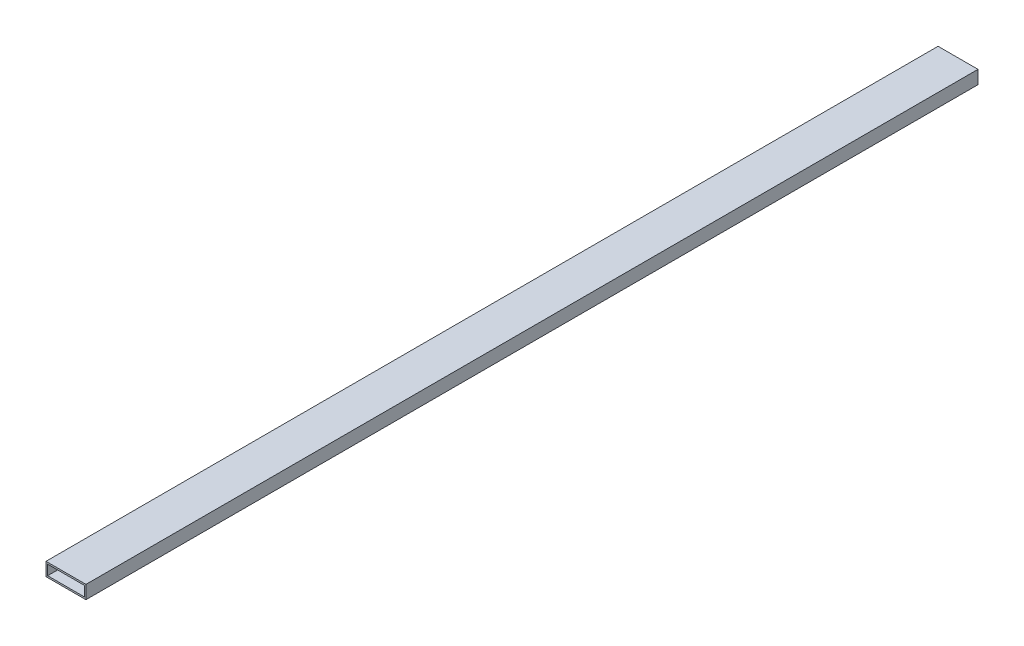
ISO-10303-21;
HEADER;
FILE_DESCRIPTION(('STEP AP214'),'2;1');
FILE_NAME('part.step','',(''),(''),'','','');
FILE_SCHEMA(('AUTOMOTIVE_DESIGN { 1 0 10303 214 1 1 1 1 }'));
ENDSEC;
DATA;
#1=APPLICATION_CONTEXT('core data for automotive mechanical design processes');
#2=APPLICATION_PROTOCOL_DEFINITION('international standard','automotive_design',2000,#1);
#3=PRODUCT_CONTEXT('',#1,'mechanical');
#4=PRODUCT('Part','Part','',(#3));
#5=PRODUCT_RELATED_PRODUCT_CATEGORY('part','',(#4));
#6=PRODUCT_DEFINITION_FORMATION('','',#4);
#7=PRODUCT_DEFINITION_CONTEXT('part definition',#1,'design');
#8=PRODUCT_DEFINITION('design','',#6,#7);
#9=PRODUCT_DEFINITION_SHAPE('','',#8);
#10=(LENGTH_UNIT() NAMED_UNIT(*) SI_UNIT(.MILLI.,.METRE.));
#11=(NAMED_UNIT(*) PLANE_ANGLE_UNIT() SI_UNIT($,.RADIAN.));
#12=(NAMED_UNIT(*) SI_UNIT($,.STERADIAN.) SOLID_ANGLE_UNIT());
#13=UNCERTAINTY_MEASURE_WITH_UNIT(LENGTH_MEASURE(1.E-05),#10,'distance_accuracy_value','');
#14=(GEOMETRIC_REPRESENTATION_CONTEXT(3) GLOBAL_UNCERTAINTY_ASSIGNED_CONTEXT((#13)) GLOBAL_UNIT_ASSIGNED_CONTEXT((#10,
#11,#12)) REPRESENTATION_CONTEXT('',''));
#15=CARTESIAN_POINT('',(0.,0.,0.));
#16=DIRECTION('',(0.,0.,1.));
#17=DIRECTION('',(1.,0.,0.));
#18=AXIS2_PLACEMENT_3D('',#15,#16,#17);
#19=CARTESIAN_POINT('',(38.1,12.7,-850.9));
#20=DIRECTION('',(1.,0.,0.));
#21=DIRECTION('',(0.,1.,0.));
#22=AXIS2_PLACEMENT_3D('',#19,#20,#21);
#23=PLANE('',#22);
#24=DIRECTION('',(0.,1.,0.));
#25=VECTOR('',#24,1.);
#26=CARTESIAN_POINT('',(38.1,12.7,850.9));
#27=LINE('',#26,#25);
#28=CARTESIAN_POINT('',(38.1,-12.7,850.9));
#29=VERTEX_POINT('',#28);
#30=CARTESIAN_POINT('',(38.1,12.7,850.9));
#31=VERTEX_POINT('',#30);
#32=EDGE_CURVE('E130',#29,#31,#27,.T.);
#33=ORIENTED_EDGE('',*,*,#32,.F.);
#34=DIRECTION('',(0.,0.,1.));
#35=VECTOR('',#34,1.);
#36=CARTESIAN_POINT('',(38.1,-12.7,-850.9));
#37=LINE('',#36,#35);
#38=CARTESIAN_POINT('',(38.1,-12.7,-850.9));
#39=VERTEX_POINT('',#38);
#40=EDGE_CURVE('E11',#39,#29,#37,.T.);
#41=ORIENTED_EDGE('',*,*,#40,.F.);
#42=DIRECTION('',(0.,1.,0.));
#43=VECTOR('',#42,1.);
#44=CARTESIAN_POINT('',(38.1,12.7,-850.9));
#45=LINE('',#44,#43);
#46=CARTESIAN_POINT('',(38.1,12.7,-850.9));
#47=VERTEX_POINT('',#46);
#48=EDGE_CURVE('E134',#39,#47,#45,.T.);
#49=ORIENTED_EDGE('',*,*,#48,.T.);
#50=DIRECTION('',(0.,0.,1.));
#51=VECTOR('',#50,1.);
#52=CARTESIAN_POINT('',(38.1,12.7,-850.9));
#53=LINE('',#52,#51);
#54=EDGE_CURVE('E35',#47,#31,#53,.T.);
#55=ORIENTED_EDGE('',*,*,#54,.T.);
#56=EDGE_LOOP('',(#33,#41,#49,#55));
#57=FACE_BOUND('',#56,.T.);
#58=ADVANCED_FACE('F32',(#57),#23,.T.);
#59=CARTESIAN_POINT('',(-38.1,-12.7,-850.9));
#60=DIRECTION('',(0.,-1.,0.));
#61=DIRECTION('',(0.,0.,-1.));
#62=AXIS2_PLACEMENT_3D('',#59,#60,#61);
#63=PLANE('',#62);
#64=DIRECTION('',(1.,0.,0.));
#65=VECTOR('',#64,1.);
#66=CARTESIAN_POINT('',(-38.1,-12.7,850.9));
#67=LINE('',#66,#65);
#68=CARTESIAN_POINT('',(-38.1,-12.7,850.9));
#69=VERTEX_POINT('',#68);
#70=EDGE_CURVE('E138',#69,#29,#67,.T.);
#71=ORIENTED_EDGE('',*,*,#70,.F.);
#72=DIRECTION('',(0.,0.,1.));
#73=VECTOR('',#72,1.);
#74=CARTESIAN_POINT('',(-38.1,-12.7,-850.9));
#75=LINE('',#74,#73);
#76=CARTESIAN_POINT('',(-38.1,-12.7,-850.9));
#77=VERTEX_POINT('',#76);
#78=EDGE_CURVE('E40',#77,#69,#75,.T.);
#79=ORIENTED_EDGE('',*,*,#78,.F.);
#80=DIRECTION('',(1.,0.,0.));
#81=VECTOR('',#80,1.);
#82=CARTESIAN_POINT('',(-38.1,-12.7,-850.9));
#83=LINE('',#82,#81);
#84=EDGE_CURVE('E144',#77,#39,#83,.T.);
#85=ORIENTED_EDGE('',*,*,#84,.T.);
#86=ORIENTED_EDGE('',*,*,#40,.T.);
#87=EDGE_LOOP('',(#71,#79,#85,#86));
#88=FACE_BOUND('',#87,.T.);
#89=ADVANCED_FACE('F170',(#88),#63,.T.);
#90=CARTESIAN_POINT('',(-38.1,12.7,-850.9));
#91=DIRECTION('',(-1.,0.,0.));
#92=DIRECTION('',(0.,0.,1.));
#93=AXIS2_PLACEMENT_3D('',#90,#91,#92);
#94=PLANE('',#93);
#95=DIRECTION('',(0.,-1.,0.));
#96=VECTOR('',#95,1.);
#97=CARTESIAN_POINT('',(-38.1,12.7,850.9));
#98=LINE('',#97,#96);
#99=CARTESIAN_POINT('',(-38.1,12.7,850.9));
#100=VERTEX_POINT('',#99);
#101=EDGE_CURVE('E152',#100,#69,#98,.T.);
#102=ORIENTED_EDGE('',*,*,#101,.F.);
#103=DIRECTION('',(0.,0.,1.));
#104=VECTOR('',#103,1.);
#105=CARTESIAN_POINT('',(-38.1,12.7,-850.9));
#106=LINE('',#105,#104);
#107=CARTESIAN_POINT('',(-38.1,12.7,-850.9));
#108=VERTEX_POINT('',#107);
#109=EDGE_CURVE('E157',#108,#100,#106,.T.);
#110=ORIENTED_EDGE('',*,*,#109,.F.);
#111=DIRECTION('',(0.,-1.,0.));
#112=VECTOR('',#111,1.);
#113=CARTESIAN_POINT('',(-38.1,12.7,-850.9));
#114=LINE('',#113,#112);
#115=EDGE_CURVE('E141',#108,#77,#114,.T.);
#116=ORIENTED_EDGE('',*,*,#115,.T.);
#117=ORIENTED_EDGE('',*,*,#78,.T.);
#118=EDGE_LOOP('',(#102,#110,#116,#117));
#119=FACE_BOUND('',#118,.T.);
#120=ADVANCED_FACE('F174',(#119),#94,.T.);
#121=CARTESIAN_POINT('',(-38.1,12.7,-850.9));
#122=DIRECTION('',(0.,1.,0.));
#123=DIRECTION('',(0.,0.,1.));
#124=AXIS2_PLACEMENT_3D('',#121,#122,#123);
#125=PLANE('',#124);
#126=DIRECTION('',(-1.,0.,0.));
#127=VECTOR('',#126,1.);
#128=CARTESIAN_POINT('',(-38.1,12.7,850.9));
#129=LINE('',#128,#127);
#130=EDGE_CURVE('E149',#31,#100,#129,.T.);
#131=ORIENTED_EDGE('',*,*,#130,.F.);
#132=ORIENTED_EDGE('',*,*,#54,.F.);
#133=DIRECTION('',(-1.,0.,0.));
#134=VECTOR('',#133,1.);
#135=CARTESIAN_POINT('',(-38.1,12.7,-850.9));
#136=LINE('',#135,#134);
#137=EDGE_CURVE('E137',#47,#108,#136,.T.);
#138=ORIENTED_EDGE('',*,*,#137,.T.);
#139=ORIENTED_EDGE('',*,*,#109,.T.);
#140=EDGE_LOOP('',(#131,#132,#138,#139));
#141=FACE_BOUND('',#140,.T.);
#142=ADVANCED_FACE('F165',(#141),#125,.T.);
#143=CARTESIAN_POINT('',(38.1,-12.7,-850.9));
#144=DIRECTION('',(0.,0.,1.));
#145=DIRECTION('',(1.,0.,0.));
#146=AXIS2_PLACEMENT_3D('',#143,#144,#145);
#147=PLANE('',#146);
#148=DIRECTION('',(0.,-1.,0.));
#149=VECTOR('',#148,1.);
#150=CARTESIAN_POINT('',(-34.925,9.52500000000001,-850.9));
#151=LINE('',#150,#149);
#152=CARTESIAN_POINT('',(-34.925,9.52500000000001,-850.9));
#153=VERTEX_POINT('',#152);
#154=CARTESIAN_POINT('',(-34.925,-9.52499999999999,-850.9));
#155=VERTEX_POINT('',#154);
#156=EDGE_CURVE('E105',#153,#155,#151,.T.);
#157=ORIENTED_EDGE('',*,*,#156,.T.);
#158=DIRECTION('',(1.,0.,0.));
#159=VECTOR('',#158,1.);
#160=CARTESIAN_POINT('',(-34.925,-9.52499999999999,-850.9));
#161=LINE('',#160,#159);
#162=CARTESIAN_POINT('',(34.925,-9.52499999999999,-850.9));
#163=VERTEX_POINT('',#162);
#164=EDGE_CURVE('E99',#155,#163,#161,.T.);
#165=ORIENTED_EDGE('',*,*,#164,.T.);
#166=DIRECTION('',(0.,1.,0.));
#167=VECTOR('',#166,1.);
#168=CARTESIAN_POINT('',(34.925,-9.52499999999999,-850.9));
#169=LINE('',#168,#167);
#170=CARTESIAN_POINT('',(34.925,9.525,-850.9));
#171=VERTEX_POINT('',#170);
#172=EDGE_CURVE('E108',#163,#171,#169,.T.);
#173=ORIENTED_EDGE('',*,*,#172,.T.);
#174=DIRECTION('',(-1.,0.,0.));
#175=VECTOR('',#174,1.);
#176=CARTESIAN_POINT('',(34.925,9.52500000000001,-850.9));
#177=LINE('',#176,#175);
#178=EDGE_CURVE('E48',#171,#153,#177,.T.);
#179=ORIENTED_EDGE('',*,*,#178,.T.);
#180=EDGE_LOOP('',(#157,#165,#173,#179));
#181=FACE_BOUND('',#180,.T.);
#182=ORIENTED_EDGE('',*,*,#48,.F.);
#183=ORIENTED_EDGE('',*,*,#84,.F.);
#184=ORIENTED_EDGE('',*,*,#115,.F.);
#185=ORIENTED_EDGE('',*,*,#137,.F.);
#186=EDGE_LOOP('',(#182,#183,#184,#185));
#187=FACE_BOUND('',#186,.T.);
#188=ADVANCED_FACE('F112',(#181,#187),#147,.F.);
#189=CARTESIAN_POINT('',(38.1,-12.7,850.9));
#190=DIRECTION('',(0.,0.,1.));
#191=DIRECTION('',(1.,0.,0.));
#192=AXIS2_PLACEMENT_3D('',#189,#190,#191);
#193=PLANE('',#192);
#194=DIRECTION('',(1.,0.,0.));
#195=VECTOR('',#194,1.);
#196=CARTESIAN_POINT('',(-34.925,-9.52499999999999,850.9));
#197=LINE('',#196,#195);
#198=CARTESIAN_POINT('',(-34.925,-9.52499999999999,850.9));
#199=VERTEX_POINT('',#198);
#200=CARTESIAN_POINT('',(34.925,-9.52499999999999,850.9));
#201=VERTEX_POINT('',#200);
#202=EDGE_CURVE('E56',#199,#201,#197,.T.);
#203=ORIENTED_EDGE('',*,*,#202,.F.);
#204=DIRECTION('',(0.,-1.,0.));
#205=VECTOR('',#204,1.);
#206=CARTESIAN_POINT('',(-34.925,9.52500000000001,850.9));
#207=LINE('',#206,#205);
#208=CARTESIAN_POINT('',(-34.925,9.52500000000001,850.9));
#209=VERTEX_POINT('',#208);
#210=EDGE_CURVE('E115',#209,#199,#207,.T.);
#211=ORIENTED_EDGE('',*,*,#210,.F.);
#212=DIRECTION('',(-1.,0.,0.));
#213=VECTOR('',#212,1.);
#214=CARTESIAN_POINT('',(34.925,9.52500000000001,850.9));
#215=LINE('',#214,#213);
#216=CARTESIAN_POINT('',(34.925,9.52500000000001,850.9));
#217=VERTEX_POINT('',#216);
#218=EDGE_CURVE('E118',#217,#209,#215,.T.);
#219=ORIENTED_EDGE('',*,*,#218,.F.);
#220=DIRECTION('',(0.,1.,0.));
#221=VECTOR('',#220,1.);
#222=CARTESIAN_POINT('',(34.925,-9.52499999999999,850.9));
#223=LINE('',#222,#221);
#224=EDGE_CURVE('E124',#201,#217,#223,.T.);
#225=ORIENTED_EDGE('',*,*,#224,.F.);
#226=EDGE_LOOP('',(#203,#211,#219,#225));
#227=FACE_BOUND('',#226,.T.);
#228=ORIENTED_EDGE('',*,*,#32,.T.);
#229=ORIENTED_EDGE('',*,*,#130,.T.);
#230=ORIENTED_EDGE('',*,*,#101,.T.);
#231=ORIENTED_EDGE('',*,*,#70,.T.);
#232=EDGE_LOOP('',(#228,#229,#230,#231));
#233=FACE_BOUND('',#232,.T.);
#234=ADVANCED_FACE('F167',(#227,#233),#193,.T.);
#235=CARTESIAN_POINT('',(-34.925,-9.52499999999999,-850.9));
#236=DIRECTION('',(0.,-1.,0.));
#237=DIRECTION('',(0.,0.,-1.));
#238=AXIS2_PLACEMENT_3D('',#235,#236,#237);
#239=PLANE('',#238);
#240=ORIENTED_EDGE('',*,*,#202,.T.);
#241=DIRECTION('',(0.,0.,1.));
#242=VECTOR('',#241,1.);
#243=CARTESIAN_POINT('',(34.925,-9.52499999999999,-850.9));
#244=LINE('',#243,#242);
#245=EDGE_CURVE('E95',#163,#201,#244,.T.);
#246=ORIENTED_EDGE('',*,*,#245,.F.);
#247=ORIENTED_EDGE('',*,*,#164,.F.);
#248=DIRECTION('',(0.,0.,1.));
#249=VECTOR('',#248,1.);
#250=CARTESIAN_POINT('',(-34.925,-9.52499999999999,-850.9));
#251=LINE('',#250,#249);
#252=EDGE_CURVE('E128',#155,#199,#251,.T.);
#253=ORIENTED_EDGE('',*,*,#252,.T.);
#254=EDGE_LOOP('',(#240,#246,#247,#253));
#255=FACE_BOUND('',#254,.T.);
#256=ADVANCED_FACE('F97',(#255),#239,.F.);
#257=CARTESIAN_POINT('',(-34.925,9.52500000000001,-850.9));
#258=DIRECTION('',(-1.,0.,0.));
#259=DIRECTION('',(0.,0.,1.));
#260=AXIS2_PLACEMENT_3D('',#257,#258,#259);
#261=PLANE('',#260);
#262=ORIENTED_EDGE('',*,*,#210,.T.);
#263=ORIENTED_EDGE('',*,*,#252,.F.);
#264=ORIENTED_EDGE('',*,*,#156,.F.);
#265=DIRECTION('',(0.,0.,1.));
#266=VECTOR('',#265,1.);
#267=CARTESIAN_POINT('',(-34.925,9.52500000000001,-850.9));
#268=LINE('',#267,#266);
#269=EDGE_CURVE('E131',#153,#209,#268,.T.);
#270=ORIENTED_EDGE('',*,*,#269,.T.);
#271=EDGE_LOOP('',(#262,#263,#264,#270));
#272=FACE_BOUND('',#271,.T.);
#273=ADVANCED_FACE('F225',(#272),#261,.F.);
#274=CARTESIAN_POINT('',(34.925,9.52500000000001,-850.9));
#275=DIRECTION('',(0.,1.,0.));
#276=DIRECTION('',(0.,0.,1.));
#277=AXIS2_PLACEMENT_3D('',#274,#275,#276);
#278=PLANE('',#277);
#279=ORIENTED_EDGE('',*,*,#218,.T.);
#280=ORIENTED_EDGE('',*,*,#269,.F.);
#281=ORIENTED_EDGE('',*,*,#178,.F.);
#282=DIRECTION('',(0.,0.,1.));
#283=VECTOR('',#282,1.);
#284=CARTESIAN_POINT('',(34.925,9.52500000000001,-850.9));
#285=LINE('',#284,#283);
#286=EDGE_CURVE('E104',#171,#217,#285,.T.);
#287=ORIENTED_EDGE('',*,*,#286,.T.);
#288=EDGE_LOOP('',(#279,#280,#281,#287));
#289=FACE_BOUND('',#288,.T.);
#290=ADVANCED_FACE('F234',(#289),#278,.F.);
#291=CARTESIAN_POINT('',(34.925,-9.52499999999999,-850.9));
#292=DIRECTION('',(1.,0.,0.));
#293=DIRECTION('',(0.,1.,0.));
#294=AXIS2_PLACEMENT_3D('',#291,#292,#293);
#295=PLANE('',#294);
#296=ORIENTED_EDGE('',*,*,#224,.T.);
#297=ORIENTED_EDGE('',*,*,#286,.F.);
#298=ORIENTED_EDGE('',*,*,#172,.F.);
#299=ORIENTED_EDGE('',*,*,#245,.T.);
#300=EDGE_LOOP('',(#296,#297,#298,#299));
#301=FACE_BOUND('',#300,.T.);
#302=ADVANCED_FACE('F109',(#301),#295,.F.);
#303=CLOSED_SHELL('',(#58,#89,#120,#142,#188,#234,#256,#273,#290,#302));
#304=MANIFOLD_SOLID_BREP('B2',#303);
#305=ADVANCED_BREP_SHAPE_REPRESENTATION('',(#18,#304),#14);
#306=SHAPE_DEFINITION_REPRESENTATION(#9,#305);
ENDSEC;
END-ISO-10303-21;
